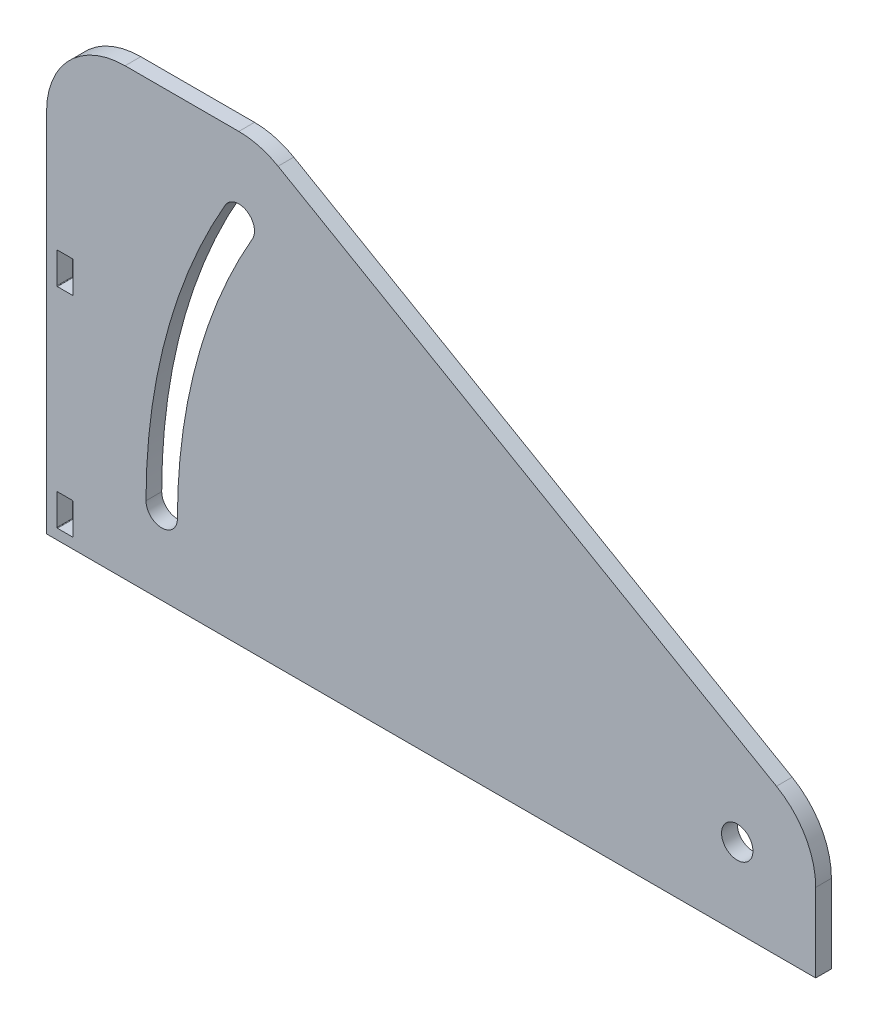
ISO-10303-21;
HEADER;
FILE_DESCRIPTION(('STEP AP214'),'2;1');
FILE_NAME('part.step','',(''),(''),'','','');
FILE_SCHEMA(('AUTOMOTIVE_DESIGN { 1 0 10303 214 1 1 1 1 }'));
ENDSEC;
DATA;
#1=APPLICATION_CONTEXT('core data for automotive mechanical design processes');
#2=APPLICATION_PROTOCOL_DEFINITION('international standard','automotive_design',2000,#1);
#3=PRODUCT_CONTEXT('',#1,'mechanical');
#4=PRODUCT('Part','Part','',(#3));
#5=PRODUCT_RELATED_PRODUCT_CATEGORY('part','',(#4));
#6=PRODUCT_DEFINITION_FORMATION('','',#4);
#7=PRODUCT_DEFINITION_CONTEXT('part definition',#1,'design');
#8=PRODUCT_DEFINITION('design','',#6,#7);
#9=PRODUCT_DEFINITION_SHAPE('','',#8);
#10=(LENGTH_UNIT() NAMED_UNIT(*) SI_UNIT(.MILLI.,.METRE.));
#11=(NAMED_UNIT(*) PLANE_ANGLE_UNIT() SI_UNIT($,.RADIAN.));
#12=(NAMED_UNIT(*) SI_UNIT($,.STERADIAN.) SOLID_ANGLE_UNIT());
#13=UNCERTAINTY_MEASURE_WITH_UNIT(LENGTH_MEASURE(1.E-05),#10,'distance_accuracy_value','');
#14=(GEOMETRIC_REPRESENTATION_CONTEXT(3) GLOBAL_UNCERTAINTY_ASSIGNED_CONTEXT((#13)) GLOBAL_UNIT_ASSIGNED_CONTEXT((#10,
#11,#12)) REPRESENTATION_CONTEXT('',''));
#15=CARTESIAN_POINT('',(0.,0.,0.));
#16=DIRECTION('',(0.,0.,1.));
#17=DIRECTION('',(1.,0.,0.));
#18=AXIS2_PLACEMENT_3D('',#15,#16,#17);
#19=CARTESIAN_POINT('',(0.,-0.525000000000063,3.));
#20=DIRECTION('',(0.,-1.,0.));
#21=DIRECTION('',(0.,0.,-1.));
#22=AXIS2_PLACEMENT_3D('',#19,#20,#21);
#23=PLANE('',#22);
#24=DIRECTION('',(-1.,0.,0.));
#25=VECTOR('',#24,1.);
#26=CARTESIAN_POINT('',(0.,-0.525000000000063,0.));
#27=LINE('',#26,#25);
#28=CARTESIAN_POINT('',(-68.575,-0.525000000000063,0.));
#29=VERTEX_POINT('',#28);
#30=CARTESIAN_POINT('',(-71.425,-0.525000000000063,0.));
#31=VERTEX_POINT('',#30);
#32=EDGE_CURVE('E534',#29,#31,#27,.T.);
#33=ORIENTED_EDGE('',*,*,#32,.T.);
#34=DIRECTION('',(0.,0.,-1.));
#35=VECTOR('',#34,1.);
#36=CARTESIAN_POINT('',(-71.425,-0.525000000000063,3.));
#37=LINE('',#36,#35);
#38=CARTESIAN_POINT('',(-71.425,-0.525000000000063,3.));
#39=VERTEX_POINT('',#38);
#40=EDGE_CURVE('E475',#31,#39,#37,.F.);
#41=ORIENTED_EDGE('',*,*,#40,.T.);
#42=DIRECTION('',(-1.,0.,0.));
#43=VECTOR('',#42,1.);
#44=CARTESIAN_POINT('',(0.,-0.525000000000063,3.));
#45=LINE('',#44,#43);
#46=CARTESIAN_POINT('',(-68.575,-0.525000000000063,3.));
#47=VERTEX_POINT('',#46);
#48=EDGE_CURVE('E309',#47,#39,#45,.T.);
#49=ORIENTED_EDGE('',*,*,#48,.F.);
#50=DIRECTION('',(0.,0.,-1.));
#51=VECTOR('',#50,1.);
#52=CARTESIAN_POINT('',(-68.575,-0.525000000000063,3.));
#53=LINE('',#52,#51);
#54=EDGE_CURVE('E471',#47,#29,#53,.T.);
#55=ORIENTED_EDGE('',*,*,#54,.T.);
#56=EDGE_LOOP('',(#33,#41,#49,#55));
#57=FACE_BOUND('',#56,.T.);
#58=ADVANCED_FACE('F44',(#57),#23,.F.);
#59=CARTESIAN_POINT('',(-71.525,0.,3.));
#60=DIRECTION('',(-1.,0.,0.));
#61=DIRECTION('',(0.,0.,1.));
#62=AXIS2_PLACEMENT_3D('',#59,#60,#61);
#63=PLANE('',#62);
#64=DIRECTION('',(0.,1.,0.));
#65=VECTOR('',#64,1.);
#66=CARTESIAN_POINT('',(-71.525,0.,3.));
#67=LINE('',#66,#65);
#68=CARTESIAN_POINT('',(-71.525,-0.425000000000063,3.));
#69=VERTEX_POINT('',#68);
#70=CARTESIAN_POINT('',(-71.525,5.42499999999994,3.));
#71=VERTEX_POINT('',#70);
#72=EDGE_CURVE('E313',#69,#71,#67,.T.);
#73=ORIENTED_EDGE('',*,*,#72,.F.);
#74=DIRECTION('',(0.,0.,-1.));
#75=VECTOR('',#74,1.);
#76=CARTESIAN_POINT('',(-71.525,-0.425000000000063,0.));
#77=LINE('',#76,#75);
#78=CARTESIAN_POINT('',(-71.525,-0.425000000000063,0.));
#79=VERTEX_POINT('',#78);
#80=EDGE_CURVE('E467',#69,#79,#77,.T.);
#81=ORIENTED_EDGE('',*,*,#80,.T.);
#82=DIRECTION('',(0.,1.,0.));
#83=VECTOR('',#82,1.);
#84=CARTESIAN_POINT('',(-71.525,0.,0.));
#85=LINE('',#84,#83);
#86=CARTESIAN_POINT('',(-71.525,5.42499999999994,0.));
#87=VERTEX_POINT('',#86);
#88=EDGE_CURVE('E415',#79,#87,#85,.T.);
#89=ORIENTED_EDGE('',*,*,#88,.T.);
#90=DIRECTION('',(0.,0.,-1.));
#91=VECTOR('',#90,1.);
#92=CARTESIAN_POINT('',(-71.525,5.42499999999994,3.));
#93=LINE('',#92,#91);
#94=EDGE_CURVE('E464',#87,#71,#93,.F.);
#95=ORIENTED_EDGE('',*,*,#94,.T.);
#96=EDGE_LOOP('',(#73,#81,#89,#95));
#97=FACE_BOUND('',#96,.T.);
#98=ADVANCED_FACE('F639',(#97),#63,.F.);
#99=CARTESIAN_POINT('',(0.,5.52499999999994,3.));
#100=DIRECTION('',(0.,-1.,0.));
#101=DIRECTION('',(0.,0.,-1.));
#102=AXIS2_PLACEMENT_3D('',#99,#100,#101);
#103=PLANE('',#102);
#104=DIRECTION('',(-1.,0.,0.));
#105=VECTOR('',#104,1.);
#106=CARTESIAN_POINT('',(0.,5.52499999999994,0.));
#107=LINE('',#106,#105);
#108=CARTESIAN_POINT('',(-68.575,5.52499999999994,0.));
#109=VERTEX_POINT('',#108);
#110=CARTESIAN_POINT('',(-71.425,5.52499999999994,0.));
#111=VERTEX_POINT('',#110);
#112=EDGE_CURVE('E409',#109,#111,#107,.T.);
#113=ORIENTED_EDGE('',*,*,#112,.F.);
#114=DIRECTION('',(0.,0.,-1.));
#115=VECTOR('',#114,1.);
#116=CARTESIAN_POINT('',(-68.575,5.52499999999994,3.));
#117=LINE('',#116,#115);
#118=CARTESIAN_POINT('',(-68.575,5.52499999999994,3.));
#119=VERTEX_POINT('',#118);
#120=EDGE_CURVE('E67',#109,#119,#117,.F.);
#121=ORIENTED_EDGE('',*,*,#120,.T.);
#122=DIRECTION('',(-1.,0.,0.));
#123=VECTOR('',#122,1.);
#124=CARTESIAN_POINT('',(0.,5.52499999999994,3.));
#125=LINE('',#124,#123);
#126=CARTESIAN_POINT('',(-71.425,5.52499999999994,3.));
#127=VERTEX_POINT('',#126);
#128=EDGE_CURVE('E316',#119,#127,#125,.T.);
#129=ORIENTED_EDGE('',*,*,#128,.T.);
#130=DIRECTION('',(0.,0.,-1.));
#131=VECTOR('',#130,1.);
#132=CARTESIAN_POINT('',(-71.425,5.52499999999994,3.));
#133=LINE('',#132,#131);
#134=EDGE_CURVE('E513',#127,#111,#133,.T.);
#135=ORIENTED_EDGE('',*,*,#134,.T.);
#136=EDGE_LOOP('',(#113,#121,#129,#135));
#137=FACE_BOUND('',#136,.T.);
#138=ADVANCED_FACE('F596',(#137),#103,.T.);
#139=CARTESIAN_POINT('',(-68.475,0.,3.));
#140=DIRECTION('',(-1.,0.,0.));
#141=DIRECTION('',(0.,0.,1.));
#142=AXIS2_PLACEMENT_3D('',#139,#140,#141);
#143=PLANE('',#142);
#144=DIRECTION('',(0.,1.,0.));
#145=VECTOR('',#144,1.);
#146=CARTESIAN_POINT('',(-68.475,0.,0.));
#147=LINE('',#146,#145);
#148=CARTESIAN_POINT('',(-68.475,-40.4250000000001,0.));
#149=VERTEX_POINT('',#148);
#150=CARTESIAN_POINT('',(-68.475,-34.5750000000001,0.));
#151=VERTEX_POINT('',#150);
#152=EDGE_CURVE('E366',#149,#151,#147,.T.);
#153=ORIENTED_EDGE('',*,*,#152,.F.);
#154=DIRECTION('',(0.,0.,-1.));
#155=VECTOR('',#154,1.);
#156=CARTESIAN_POINT('',(-68.475,-40.4250000000001,3.));
#157=LINE('',#156,#155);
#158=CARTESIAN_POINT('',(-68.475,-40.4250000000001,3.));
#159=VERTEX_POINT('',#158);
#160=EDGE_CURVE('E496',#149,#159,#157,.F.);
#161=ORIENTED_EDGE('',*,*,#160,.T.);
#162=DIRECTION('',(0.,1.,0.));
#163=VECTOR('',#162,1.);
#164=CARTESIAN_POINT('',(-68.475,0.,3.));
#165=LINE('',#164,#163);
#166=CARTESIAN_POINT('',(-68.475,-34.5750000000001,3.));
#167=VERTEX_POINT('',#166);
#168=EDGE_CURVE('E293',#159,#167,#165,.T.);
#169=ORIENTED_EDGE('',*,*,#168,.T.);
#170=DIRECTION('',(0.,0.,-1.));
#171=VECTOR('',#170,1.);
#172=CARTESIAN_POINT('',(-68.475,-34.5750000000001,3.));
#173=LINE('',#172,#171);
#174=EDGE_CURVE('E492',#167,#151,#173,.T.);
#175=ORIENTED_EDGE('',*,*,#174,.T.);
#176=EDGE_LOOP('',(#153,#161,#169,#175));
#177=FACE_BOUND('',#176,.T.);
#178=ADVANCED_FACE('F624',(#177),#143,.T.);
#179=CARTESIAN_POINT('',(0.,-40.5250000000001,3.));
#180=DIRECTION('',(0.,1.,0.));
#181=DIRECTION('',(0.,0.,1.));
#182=AXIS2_PLACEMENT_3D('',#179,#180,#181);
#183=PLANE('',#182);
#184=DIRECTION('',(1.,0.,0.));
#185=VECTOR('',#184,1.);
#186=CARTESIAN_POINT('',(0.,-40.5250000000001,0.));
#187=LINE('',#186,#185);
#188=CARTESIAN_POINT('',(-71.425,-40.5250000000001,0.));
#189=VERTEX_POINT('',#188);
#190=CARTESIAN_POINT('',(-68.575,-40.5250000000001,0.));
#191=VERTEX_POINT('',#190);
#192=EDGE_CURVE('E373',#189,#191,#187,.T.);
#193=ORIENTED_EDGE('',*,*,#192,.F.);
#194=DIRECTION('',(0.,0.,-1.));
#195=VECTOR('',#194,1.);
#196=CARTESIAN_POINT('',(-71.425,-40.5250000000001,3.));
#197=LINE('',#196,#195);
#198=CARTESIAN_POINT('',(-71.425,-40.5250000000001,3.));
#199=VERTEX_POINT('',#198);
#200=EDGE_CURVE('E489',#189,#199,#197,.F.);
#201=ORIENTED_EDGE('',*,*,#200,.T.);
#202=DIRECTION('',(1.,0.,0.));
#203=VECTOR('',#202,1.);
#204=CARTESIAN_POINT('',(0.,-40.5250000000001,3.));
#205=LINE('',#204,#203);
#206=CARTESIAN_POINT('',(-68.575,-40.5250000000001,3.));
#207=VERTEX_POINT('',#206);
#208=EDGE_CURVE('E297',#199,#207,#205,.T.);
#209=ORIENTED_EDGE('',*,*,#208,.T.);
#210=DIRECTION('',(0.,0.,-1.));
#211=VECTOR('',#210,1.);
#212=CARTESIAN_POINT('',(-68.575,-40.5250000000001,0.));
#213=LINE('',#212,#211);
#214=EDGE_CURVE('E485',#207,#191,#213,.T.);
#215=ORIENTED_EDGE('',*,*,#214,.T.);
#216=EDGE_LOOP('',(#193,#201,#209,#215));
#217=FACE_BOUND('',#216,.T.);
#218=ADVANCED_FACE('F559',(#217),#183,.T.);
#219=CARTESIAN_POINT('',(-71.525,0.,3.));
#220=DIRECTION('',(-1.,0.,0.));
#221=DIRECTION('',(0.,0.,1.));
#222=AXIS2_PLACEMENT_3D('',#219,#220,#221);
#223=PLANE('',#222);
#224=DIRECTION('',(0.,1.,0.));
#225=VECTOR('',#224,1.);
#226=CARTESIAN_POINT('',(-71.525,0.,3.));
#227=LINE('',#226,#225);
#228=CARTESIAN_POINT('',(-71.525,-40.4250000000001,3.));
#229=VERTEX_POINT('',#228);
#230=CARTESIAN_POINT('',(-71.525,-34.5750000000001,3.));
#231=VERTEX_POINT('',#230);
#232=EDGE_CURVE('E301',#229,#231,#227,.T.);
#233=ORIENTED_EDGE('',*,*,#232,.F.);
#234=DIRECTION('',(0.,0.,-1.));
#235=VECTOR('',#234,1.);
#236=CARTESIAN_POINT('',(-71.525,-40.4250000000001,3.));
#237=LINE('',#236,#235);
#238=CARTESIAN_POINT('',(-71.525,-40.4250000000001,0.));
#239=VERTEX_POINT('',#238);
#240=EDGE_CURVE('E481',#229,#239,#237,.T.);
#241=ORIENTED_EDGE('',*,*,#240,.T.);
#242=DIRECTION('',(0.,1.,0.));
#243=VECTOR('',#242,1.);
#244=CARTESIAN_POINT('',(-71.525,0.,0.));
#245=LINE('',#244,#243);
#246=CARTESIAN_POINT('',(-71.525,-34.5750000000001,0.));
#247=VERTEX_POINT('',#246);
#248=EDGE_CURVE('E542',#239,#247,#245,.T.);
#249=ORIENTED_EDGE('',*,*,#248,.T.);
#250=DIRECTION('',(0.,0.,-1.));
#251=VECTOR('',#250,1.);
#252=CARTESIAN_POINT('',(-71.525,-34.5750000000001,3.));
#253=LINE('',#252,#251);
#254=EDGE_CURVE('E478',#247,#231,#253,.F.);
#255=ORIENTED_EDGE('',*,*,#254,.T.);
#256=EDGE_LOOP('',(#233,#241,#249,#255));
#257=FACE_BOUND('',#256,.T.);
#258=ADVANCED_FACE('F651',(#257),#223,.F.);
#259=CARTESIAN_POINT('',(58.5,-27.5000000000001,3.));
#260=DIRECTION('',(0.,0.,-1.));
#261=DIRECTION('',(-1.,0.,0.));
#262=AXIS2_PLACEMENT_3D('',#259,#260,#261);
#263=CYLINDRICAL_SURFACE('',#262,107.);
#264=CARTESIAN_POINT('',(58.5,-27.5000000000001,0.));
#265=DIRECTION('',(0.,0.,1.));
#266=DIRECTION('',(1.,0.,0.));
#267=AXIS2_PLACEMENT_3D('',#264,#265,#266);
#268=CIRCLE('',#267,107.);
#269=CARTESIAN_POINT('',(-34.1647182049349,26.0000000000001,0.));
#270=VERTEX_POINT('',#269);
#271=CARTESIAN_POINT('',(-48.5,-27.5000000000001,0.));
#272=VERTEX_POINT('',#271);
#273=EDGE_CURVE('E346',#270,#272,#268,.T.);
#274=ORIENTED_EDGE('',*,*,#273,.T.);
#275=DIRECTION('',(0.,0.,-1.));
#276=VECTOR('',#275,1.);
#277=CARTESIAN_POINT('',(-48.5,-27.5000000000001,3.));
#278=LINE('',#277,#276);
#279=CARTESIAN_POINT('',(-48.5,-27.5000000000001,3.));
#280=VERTEX_POINT('',#279);
#281=EDGE_CURVE('E433',#280,#272,#278,.T.);
#282=ORIENTED_EDGE('',*,*,#281,.F.);
#283=CARTESIAN_POINT('',(58.5,-27.5000000000001,3.));
#284=DIRECTION('',(0.,0.,1.));
#285=DIRECTION('',(1.,0.,0.));
#286=AXIS2_PLACEMENT_3D('',#283,#284,#285);
#287=CIRCLE('',#286,107.);
#288=CARTESIAN_POINT('',(-34.1647182049349,26.0000000000001,3.));
#289=VERTEX_POINT('',#288);
#290=EDGE_CURVE('E278',#289,#280,#287,.T.);
#291=ORIENTED_EDGE('',*,*,#290,.F.);
#292=DIRECTION('',(0.,0.,-1.));
#293=VECTOR('',#292,1.);
#294=CARTESIAN_POINT('',(-34.1647182049349,26.0000000000001,3.));
#295=LINE('',#294,#293);
#296=EDGE_CURVE('E255',#289,#270,#295,.T.);
#297=ORIENTED_EDGE('',*,*,#296,.T.);
#298=EDGE_LOOP('',(#274,#282,#291,#297));
#299=FACE_BOUND('',#298,.T.);
#300=ADVANCED_FACE('F654',(#299),#263,.T.);
#301=CARTESIAN_POINT('',(-51.5,-27.5000000000001,3.));
#302=DIRECTION('',(0.,0.,-1.));
#303=DIRECTION('',(-1.,0.,0.));
#304=AXIS2_PLACEMENT_3D('',#301,#302,#303);
#305=CYLINDRICAL_SURFACE('',#304,2.99999999999999);
#306=CARTESIAN_POINT('',(-51.5,-27.5000000000001,0.));
#307=DIRECTION('',(0.,0.,1.));
#308=DIRECTION('',(1.,0.,0.));
#309=AXIS2_PLACEMENT_3D('',#306,#307,#308);
#310=CIRCLE('',#309,2.99999999999999);
#311=CARTESIAN_POINT('',(-54.5,-27.5000000000001,0.));
#312=VERTEX_POINT('',#311);
#313=EDGE_CURVE('E354',#312,#272,#310,.T.);
#314=ORIENTED_EDGE('',*,*,#313,.F.);
#315=DIRECTION('',(0.,0.,-1.));
#316=VECTOR('',#315,1.);
#317=CARTESIAN_POINT('',(-54.5,-27.5000000000001,3.));
#318=LINE('',#317,#316);
#319=CARTESIAN_POINT('',(-54.5,-27.5000000000001,3.));
#320=VERTEX_POINT('',#319);
#321=EDGE_CURVE('E430',#320,#312,#318,.T.);
#322=ORIENTED_EDGE('',*,*,#321,.F.);
#323=CARTESIAN_POINT('',(-51.5,-27.5000000000001,3.));
#324=DIRECTION('',(0.,0.,1.));
#325=DIRECTION('',(1.,0.,0.));
#326=AXIS2_PLACEMENT_3D('',#323,#324,#325);
#327=CIRCLE('',#326,2.99999999999999);
#328=EDGE_CURVE('E281',#320,#280,#327,.T.);
#329=ORIENTED_EDGE('',*,*,#328,.T.);
#330=ORIENTED_EDGE('',*,*,#281,.T.);
#331=EDGE_LOOP('',(#314,#322,#329,#330));
#332=FACE_BOUND('',#331,.T.);
#333=ADVANCED_FACE('F666',(#332),#305,.F.);
#334=CARTESIAN_POINT('',(58.5,-27.5000000000001,3.));
#335=DIRECTION('',(0.,0.,-1.));
#336=DIRECTION('',(-1.,0.,0.));
#337=AXIS2_PLACEMENT_3D('',#334,#335,#336);
#338=CYLINDRICAL_SURFACE('',#337,113.);
#339=CARTESIAN_POINT('',(58.5,-27.5000000000001,0.));
#340=DIRECTION('',(0.,0.,1.));
#341=DIRECTION('',(1.,0.,0.));
#342=AXIS2_PLACEMENT_3D('',#339,#340,#341);
#343=CIRCLE('',#342,113.);
#344=CARTESIAN_POINT('',(-39.3608706276415,29.0000000000001,0.));
#345=VERTEX_POINT('',#344);
#346=EDGE_CURVE('E367',#345,#312,#343,.T.);
#347=ORIENTED_EDGE('',*,*,#346,.F.);
#348=DIRECTION('',(0.,0.,-1.));
#349=VECTOR('',#348,1.);
#350=CARTESIAN_POINT('',(-39.3608706276415,29.0000000000001,3.));
#351=LINE('',#350,#349);
#352=CARTESIAN_POINT('',(-39.3608706276415,29.0000000000001,3.));
#353=VERTEX_POINT('',#352);
#354=EDGE_CURVE('E427',#353,#345,#351,.T.);
#355=ORIENTED_EDGE('',*,*,#354,.F.);
#356=CARTESIAN_POINT('',(58.5,-27.5000000000001,3.));
#357=DIRECTION('',(0.,0.,1.));
#358=DIRECTION('',(1.,0.,0.));
#359=AXIS2_PLACEMENT_3D('',#356,#357,#358);
#360=CIRCLE('',#359,113.);
#361=EDGE_CURVE('E285',#353,#320,#360,.T.);
#362=ORIENTED_EDGE('',*,*,#361,.T.);
#363=ORIENTED_EDGE('',*,*,#321,.T.);
#364=EDGE_LOOP('',(#347,#355,#362,#363));
#365=FACE_BOUND('',#364,.T.);
#366=ADVANCED_FACE('F663',(#365),#338,.F.);
#367=CARTESIAN_POINT('',(0.,-42.5000000000001,3.));
#368=DIRECTION('',(0.,1.,0.));
#369=DIRECTION('',(0.,0.,1.));
#370=AXIS2_PLACEMENT_3D('',#367,#368,#369);
#371=PLANE('',#370);
#372=DIRECTION('',(1.,0.,0.));
#373=VECTOR('',#372,1.);
#374=CARTESIAN_POINT('',(0.,-42.5000000000001,0.));
#375=LINE('',#374,#373);
#376=CARTESIAN_POINT('',(-73.5,-42.5000000000001,0.));
#377=VERTEX_POINT('',#376);
#378=CARTESIAN_POINT('',(73.5,-42.5000000000001,0.));
#379=VERTEX_POINT('',#378);
#380=EDGE_CURVE('E250',#377,#379,#375,.T.);
#381=ORIENTED_EDGE('',*,*,#380,.T.);
#382=DIRECTION('',(0.,0.,-1.));
#383=VECTOR('',#382,1.);
#384=CARTESIAN_POINT('',(73.5,-42.5000000000001,3.));
#385=LINE('',#384,#383);
#386=CARTESIAN_POINT('',(73.5,-42.5000000000001,3.));
#387=VERTEX_POINT('',#386);
#388=EDGE_CURVE('E247',#387,#379,#385,.T.);
#389=ORIENTED_EDGE('',*,*,#388,.F.);
#390=DIRECTION('',(1.,0.,0.));
#391=VECTOR('',#390,1.);
#392=CARTESIAN_POINT('',(0.,-42.5000000000001,3.));
#393=LINE('',#392,#391);
#394=CARTESIAN_POINT('',(-73.5,-42.5000000000001,3.));
#395=VERTEX_POINT('',#394);
#396=EDGE_CURVE('E231',#395,#387,#393,.T.);
#397=ORIENTED_EDGE('',*,*,#396,.F.);
#398=DIRECTION('',(0.,0.,-1.));
#399=VECTOR('',#398,1.);
#400=CARTESIAN_POINT('',(-73.5,-42.5000000000001,3.));
#401=LINE('',#400,#399);
#402=EDGE_CURVE('E327',#395,#377,#401,.T.);
#403=ORIENTED_EDGE('',*,*,#402,.T.);
#404=EDGE_LOOP('',(#381,#389,#397,#403));
#405=FACE_BOUND('',#404,.T.);
#406=ADVANCED_FACE('F248',(#405),#371,.F.);
#407=CARTESIAN_POINT('',(73.5,0.,3.));
#408=DIRECTION('',(1.,0.,0.));
#409=DIRECTION('',(0.,1.,0.));
#410=AXIS2_PLACEMENT_3D('',#407,#408,#409);
#411=PLANE('',#410);
#412=DIRECTION('',(0.,-1.,0.));
#413=VECTOR('',#412,1.);
#414=CARTESIAN_POINT('',(73.5,0.,0.));
#415=LINE('',#414,#413);
#416=CARTESIAN_POINT('',(73.5,-27.5000000000001,0.));
#417=VERTEX_POINT('',#416);
#418=EDGE_CURVE('E331',#417,#379,#415,.T.);
#419=ORIENTED_EDGE('',*,*,#418,.F.);
#420=DIRECTION('',(0.,0.,-1.));
#421=VECTOR('',#420,1.);
#422=CARTESIAN_POINT('',(73.5,-27.5000000000001,3.));
#423=LINE('',#422,#421);
#424=CARTESIAN_POINT('',(73.5,-27.5000000000001,3.));
#425=VERTEX_POINT('',#424);
#426=EDGE_CURVE('E256',#425,#417,#423,.T.);
#427=ORIENTED_EDGE('',*,*,#426,.F.);
#428=DIRECTION('',(0.,-1.,0.));
#429=VECTOR('',#428,1.);
#430=CARTESIAN_POINT('',(73.5,0.,3.));
#431=LINE('',#430,#429);
#432=EDGE_CURVE('E237',#425,#387,#431,.T.);
#433=ORIENTED_EDGE('',*,*,#432,.T.);
#434=ORIENTED_EDGE('',*,*,#388,.T.);
#435=EDGE_LOOP('',(#419,#427,#433,#434));
#436=FACE_BOUND('',#435,.T.);
#437=ADVANCED_FACE('F258',(#436),#411,.T.);
#438=CARTESIAN_POINT('',(58.5,-27.5000000000001,3.));
#439=DIRECTION('',(0.,0.,-1.));
#440=DIRECTION('',(-1.,0.,0.));
#441=AXIS2_PLACEMENT_3D('',#438,#439,#440);
#442=CYLINDRICAL_SURFACE('',#441,15.);
#443=CARTESIAN_POINT('',(58.5,-27.5000000000001,0.));
#444=DIRECTION('',(0.,0.,1.));
#445=DIRECTION('',(1.,0.,0.));
#446=AXIS2_PLACEMENT_3D('',#443,#444,#445);
#447=CIRCLE('',#446,15.);
#448=CARTESIAN_POINT('',(66.,-14.5096189432335,0.));
#449=VERTEX_POINT('',#448);
#450=EDGE_CURVE('E1053',#417,#449,#447,.T.);
#451=ORIENTED_EDGE('',*,*,#450,.T.);
#452=DIRECTION('',(0.,0.,-1.));
#453=VECTOR('',#452,1.);
#454=CARTESIAN_POINT('',(66.,-14.5096189432335,3.));
#455=LINE('',#454,#453);
#456=CARTESIAN_POINT('',(66.,-14.5096189432335,3.));
#457=VERTEX_POINT('',#456);
#458=EDGE_CURVE('E446',#457,#449,#455,.T.);
#459=ORIENTED_EDGE('',*,*,#458,.F.);
#460=CARTESIAN_POINT('',(58.5,-27.5000000000001,3.));
#461=DIRECTION('',(0.,0.,1.));
#462=DIRECTION('',(1.,0.,0.));
#463=AXIS2_PLACEMENT_3D('',#460,#461,#462);
#464=CIRCLE('',#463,15.);
#465=EDGE_CURVE('E261',#425,#457,#464,.T.);
#466=ORIENTED_EDGE('',*,*,#465,.F.);
#467=ORIENTED_EDGE('',*,*,#426,.T.);
#468=EDGE_LOOP('',(#451,#459,#466,#467));
#469=FACE_BOUND('',#468,.T.);
#470=ADVANCED_FACE('F689',(#469),#442,.T.);
#471=CARTESIAN_POINT('',(10.217150697964,17.6966241174614,3.));
#472=DIRECTION('',(-0.500000000000001,-0.866025403784438,0.));
#473=DIRECTION('',(0.866025403784438,-0.500000000000001,0.));
#474=AXIS2_PLACEMENT_3D('',#471,#472,#473);
#475=PLANE('',#474);
#476=DIRECTION('',(-0.866025403784438,0.500000000000001,0.));
#477=VECTOR('',#476,1.);
#478=CARTESIAN_POINT('',(10.217150697964,17.6966241174614,0.));
#479=LINE('',#478,#477);
#480=CARTESIAN_POINT('',(-29.2627944162882,40.4903810567666,0.));
#481=VERTEX_POINT('',#480);
#482=EDGE_CURVE('E1050',#449,#481,#479,.T.);
#483=ORIENTED_EDGE('',*,*,#482,.T.);
#484=DIRECTION('',(0.,0.,-1.));
#485=VECTOR('',#484,1.);
#486=CARTESIAN_POINT('',(-29.2627944162882,40.4903810567666,3.));
#487=LINE('',#486,#485);
#488=CARTESIAN_POINT('',(-29.2627944162882,40.4903810567666,3.));
#489=VERTEX_POINT('',#488);
#490=EDGE_CURVE('E458',#481,#489,#487,.F.);
#491=ORIENTED_EDGE('',*,*,#490,.T.);
#492=DIRECTION('',(-0.866025403784438,0.500000000000001,0.));
#493=VECTOR('',#492,1.);
#494=CARTESIAN_POINT('',(10.217150697964,17.6966241174614,3.));
#495=LINE('',#494,#493);
#496=EDGE_CURVE('E264',#457,#489,#495,.T.);
#497=ORIENTED_EDGE('',*,*,#496,.F.);
#498=ORIENTED_EDGE('',*,*,#458,.T.);
#499=EDGE_LOOP('',(#483,#491,#497,#498));
#500=FACE_BOUND('',#499,.T.);
#501=ADVANCED_FACE('F685',(#500),#475,.F.);
#502=CARTESIAN_POINT('',(0.,42.5,3.));
#503=DIRECTION('',(0.,1.,0.));
#504=DIRECTION('',(0.,0.,1.));
#505=AXIS2_PLACEMENT_3D('',#502,#503,#504);
#506=PLANE('',#505);
#507=DIRECTION('',(1.,0.,0.));
#508=VECTOR('',#507,1.);
#509=CARTESIAN_POINT('',(0.,42.5,3.));
#510=LINE('',#509,#508);
#511=CARTESIAN_POINT('',(-58.5,42.5,3.));
#512=VERTEX_POINT('',#511);
#513=CARTESIAN_POINT('',(-36.7627944162882,42.5,3.));
#514=VERTEX_POINT('',#513);
#515=EDGE_CURVE('E269',#512,#514,#510,.T.);
#516=ORIENTED_EDGE('',*,*,#515,.T.);
#517=DIRECTION('',(0.,0.,-1.));
#518=VECTOR('',#517,1.);
#519=CARTESIAN_POINT('',(-36.7627944162882,42.5,0.));
#520=LINE('',#519,#518);
#521=CARTESIAN_POINT('',(-36.7627944162882,42.5,0.));
#522=VERTEX_POINT('',#521);
#523=EDGE_CURVE('E436',#514,#522,#520,.T.);
#524=ORIENTED_EDGE('',*,*,#523,.T.);
#525=DIRECTION('',(1.,0.,0.));
#526=VECTOR('',#525,1.);
#527=CARTESIAN_POINT('',(0.,42.5,0.));
#528=LINE('',#527,#526);
#529=CARTESIAN_POINT('',(-58.5,42.5,0.));
#530=VERTEX_POINT('',#529);
#531=EDGE_CURVE('E1034',#530,#522,#528,.T.);
#532=ORIENTED_EDGE('',*,*,#531,.F.);
#533=DIRECTION('',(0.,0.,-1.));
#534=VECTOR('',#533,1.);
#535=CARTESIAN_POINT('',(-58.5,42.5,3.));
#536=LINE('',#535,#534);
#537=EDGE_CURVE('E443',#512,#530,#536,.T.);
#538=ORIENTED_EDGE('',*,*,#537,.F.);
#539=EDGE_LOOP('',(#516,#524,#532,#538));
#540=FACE_BOUND('',#539,.T.);
#541=ADVANCED_FACE('F681',(#540),#506,.T.);
#542=CARTESIAN_POINT('',(-58.5,27.5,3.));
#543=DIRECTION('',(0.,0.,-1.));
#544=DIRECTION('',(-1.,0.,0.));
#545=AXIS2_PLACEMENT_3D('',#542,#543,#544);
#546=CYLINDRICAL_SURFACE('',#545,15.);
#547=CARTESIAN_POINT('',(-58.5,27.5,0.));
#548=DIRECTION('',(0.,0.,1.));
#549=DIRECTION('',(1.,0.,0.));
#550=AXIS2_PLACEMENT_3D('',#547,#548,#549);
#551=CIRCLE('',#550,15.);
#552=CARTESIAN_POINT('',(-73.5,27.5,0.));
#553=VERTEX_POINT('',#552);
#554=EDGE_CURVE('E347',#530,#553,#551,.T.);
#555=ORIENTED_EDGE('',*,*,#554,.T.);
#556=DIRECTION('',(0.,0.,-1.));
#557=VECTOR('',#556,1.);
#558=CARTESIAN_POINT('',(-73.5,27.5,3.));
#559=LINE('',#558,#557);
#560=CARTESIAN_POINT('',(-73.5,27.5,3.));
#561=VERTEX_POINT('',#560);
#562=EDGE_CURVE('E439',#561,#553,#559,.T.);
#563=ORIENTED_EDGE('',*,*,#562,.F.);
#564=CARTESIAN_POINT('',(-58.5,27.5,3.));
#565=DIRECTION('',(0.,0.,1.));
#566=DIRECTION('',(1.,0.,0.));
#567=AXIS2_PLACEMENT_3D('',#564,#565,#566);
#568=CIRCLE('',#567,15.);
#569=EDGE_CURVE('E273',#512,#561,#568,.T.);
#570=ORIENTED_EDGE('',*,*,#569,.F.);
#571=ORIENTED_EDGE('',*,*,#537,.T.);
#572=EDGE_LOOP('',(#555,#563,#570,#571));
#573=FACE_BOUND('',#572,.T.);
#574=ADVANCED_FACE('F678',(#573),#546,.T.);
#575=CARTESIAN_POINT('',(-68.475,0.,3.));
#576=DIRECTION('',(-1.,0.,0.));
#577=DIRECTION('',(0.,0.,1.));
#578=AXIS2_PLACEMENT_3D('',#575,#576,#577);
#579=PLANE('',#578);
#580=DIRECTION('',(0.,1.,0.));
#581=VECTOR('',#580,1.);
#582=CARTESIAN_POINT('',(-68.475,0.,0.));
#583=LINE('',#582,#581);
#584=CARTESIAN_POINT('',(-68.475,-0.425000000000063,0.));
#585=VERTEX_POINT('',#584);
#586=CARTESIAN_POINT('',(-68.475,5.42499999999994,0.));
#587=VERTEX_POINT('',#586);
#588=EDGE_CURVE('E414',#585,#587,#583,.T.);
#589=ORIENTED_EDGE('',*,*,#588,.F.);
#590=DIRECTION('',(0.,0.,-1.));
#591=VECTOR('',#590,1.);
#592=CARTESIAN_POINT('',(-68.475,-0.425000000000063,3.));
#593=LINE('',#592,#591);
#594=CARTESIAN_POINT('',(-68.475,-0.425000000000063,3.));
#595=VERTEX_POINT('',#594);
#596=EDGE_CURVE('E503',#585,#595,#593,.F.);
#597=ORIENTED_EDGE('',*,*,#596,.T.);
#598=DIRECTION('',(0.,1.,0.));
#599=VECTOR('',#598,1.);
#600=CARTESIAN_POINT('',(-68.475,0.,3.));
#601=LINE('',#600,#599);
#602=CARTESIAN_POINT('',(-68.475,5.42499999999994,3.));
#603=VERTEX_POINT('',#602);
#604=EDGE_CURVE('E319',#595,#603,#601,.T.);
#605=ORIENTED_EDGE('',*,*,#604,.T.);
#606=DIRECTION('',(0.,0.,-1.));
#607=VECTOR('',#606,1.);
#608=CARTESIAN_POINT('',(-68.475,5.42499999999994,0.));
#609=LINE('',#608,#607);
#610=EDGE_CURVE('E499',#603,#587,#609,.T.);
#611=ORIENTED_EDGE('',*,*,#610,.T.);
#612=EDGE_LOOP('',(#589,#597,#605,#611));
#613=FACE_BOUND('',#612,.T.);
#614=ADVANCED_FACE('F592',(#613),#579,.T.);
#615=CARTESIAN_POINT('',(0.,-34.4750000000001,3.));
#616=DIRECTION('',(0.,1.,0.));
#617=DIRECTION('',(0.,0.,1.));
#618=AXIS2_PLACEMENT_3D('',#615,#616,#617);
#619=PLANE('',#618);
#620=DIRECTION('',(1.,0.,0.));
#621=VECTOR('',#620,1.);
#622=CARTESIAN_POINT('',(0.,-34.4750000000001,0.));
#623=LINE('',#622,#621);
#624=CARTESIAN_POINT('',(-71.425,-34.4750000000001,0.));
#625=VERTEX_POINT('',#624);
#626=CARTESIAN_POINT('',(-68.575,-34.4750000000001,0.));
#627=VERTEX_POINT('',#626);
#628=EDGE_CURVE('E538',#625,#627,#623,.T.);
#629=ORIENTED_EDGE('',*,*,#628,.T.);
#630=DIRECTION('',(0.,0.,-1.));
#631=VECTOR('',#630,1.);
#632=CARTESIAN_POINT('',(-68.575,-34.4750000000001,3.));
#633=LINE('',#632,#631);
#634=CARTESIAN_POINT('',(-68.575,-34.4750000000001,3.));
#635=VERTEX_POINT('',#634);
#636=EDGE_CURVE('E510',#627,#635,#633,.F.);
#637=ORIENTED_EDGE('',*,*,#636,.T.);
#638=DIRECTION('',(1.,0.,0.));
#639=VECTOR('',#638,1.);
#640=CARTESIAN_POINT('',(0.,-34.4750000000001,3.));
#641=LINE('',#640,#639);
#642=CARTESIAN_POINT('',(-71.425,-34.4750000000001,3.));
#643=VERTEX_POINT('',#642);
#644=EDGE_CURVE('E305',#643,#635,#641,.T.);
#645=ORIENTED_EDGE('',*,*,#644,.F.);
#646=DIRECTION('',(0.,0.,-1.));
#647=VECTOR('',#646,1.);
#648=CARTESIAN_POINT('',(-71.425,-34.4750000000001,0.));
#649=LINE('',#648,#647);
#650=EDGE_CURVE('E506',#643,#625,#649,.T.);
#651=ORIENTED_EDGE('',*,*,#650,.T.);
#652=EDGE_LOOP('',(#629,#637,#645,#651));
#653=FACE_BOUND('',#652,.T.);
#654=ADVANCED_FACE('F616',(#653),#619,.F.);
#655=CARTESIAN_POINT('',(-36.7627944162882,27.5,3.));
#656=DIRECTION('',(0.,0.,-1.));
#657=DIRECTION('',(-1.,0.,0.));
#658=AXIS2_PLACEMENT_3D('',#655,#656,#657);
#659=CYLINDRICAL_SURFACE('',#658,2.99999999999999);
#660=CARTESIAN_POINT('',(-36.7627944162882,27.5,0.));
#661=DIRECTION('',(0.,0.,1.));
#662=DIRECTION('',(1.,0.,0.));
#663=AXIS2_PLACEMENT_3D('',#660,#661,#662);
#664=CIRCLE('',#663,2.99999999999999);
#665=EDGE_CURVE('E361',#270,#345,#664,.T.);
#666=ORIENTED_EDGE('',*,*,#665,.F.);
#667=ORIENTED_EDGE('',*,*,#296,.F.);
#668=CARTESIAN_POINT('',(-36.7627944162882,27.5,3.));
#669=DIRECTION('',(0.,0.,1.));
#670=DIRECTION('',(1.,0.,0.));
#671=AXIS2_PLACEMENT_3D('',#668,#669,#670);
#672=CIRCLE('',#671,2.99999999999999);
#673=EDGE_CURVE('E289',#289,#353,#672,.T.);
#674=ORIENTED_EDGE('',*,*,#673,.T.);
#675=ORIENTED_EDGE('',*,*,#354,.T.);
#676=EDGE_LOOP('',(#666,#667,#674,#675));
#677=FACE_BOUND('',#676,.T.);
#678=ADVANCED_FACE('F650',(#677),#659,.F.);
#679=CARTESIAN_POINT('',(-73.5,0.,3.));
#680=DIRECTION('',(1.,0.,0.));
#681=DIRECTION('',(0.,1.,0.));
#682=AXIS2_PLACEMENT_3D('',#679,#680,#681);
#683=PLANE('',#682);
#684=DIRECTION('',(0.,-1.,0.));
#685=VECTOR('',#684,1.);
#686=CARTESIAN_POINT('',(-73.5,0.,0.));
#687=LINE('',#686,#685);
#688=EDGE_CURVE('E342',#553,#377,#687,.T.);
#689=ORIENTED_EDGE('',*,*,#688,.T.);
#690=ORIENTED_EDGE('',*,*,#402,.F.);
#691=DIRECTION('',(0.,-1.,0.));
#692=VECTOR('',#691,1.);
#693=CARTESIAN_POINT('',(-73.5,0.,3.));
#694=LINE('',#693,#692);
#695=EDGE_CURVE('E239',#561,#395,#694,.T.);
#696=ORIENTED_EDGE('',*,*,#695,.F.);
#697=ORIENTED_EDGE('',*,*,#562,.T.);
#698=EDGE_LOOP('',(#689,#690,#696,#697));
#699=FACE_BOUND('',#698,.T.);
#700=ADVANCED_FACE('F661',(#699),#683,.F.);
#701=CARTESIAN_POINT('',(58.5,-27.5000000000001,3.));
#702=DIRECTION('',(0.,0.,-1.));
#703=DIRECTION('',(-1.,0.,0.));
#704=AXIS2_PLACEMENT_3D('',#701,#702,#703);
#705=CYLINDRICAL_SURFACE('',#704,3.00000000000002);
#706=CARTESIAN_POINT('',(58.5,-27.5000000000001,3.));
#707=DIRECTION('',(0.,0.,1.));
#708=DIRECTION('',(1.,0.,0.));
#709=AXIS2_PLACEMENT_3D('',#706,#707,#708);
#710=CIRCLE('',#709,3.00000000000002);
#711=CARTESIAN_POINT('',(61.5,-27.5000000000001,3.));
#712=VERTEX_POINT('',#711);
#713=EDGE_CURVE('E323',#712,#712,#710,.T.);
#714=ORIENTED_EDGE('',*,*,#713,.T.);
#715=EDGE_LOOP('',(#714));
#716=FACE_BOUND('',#715,.T.);
#717=CARTESIAN_POINT('',(58.5,-27.5000000000001,0.));
#718=DIRECTION('',(0.,0.,1.));
#719=DIRECTION('',(1.,0.,0.));
#720=AXIS2_PLACEMENT_3D('',#717,#718,#719);
#721=CIRCLE('',#720,3.00000000000002);
#722=CARTESIAN_POINT('',(61.5,-27.5000000000001,0.));
#723=VERTEX_POINT('',#722);
#724=EDGE_CURVE('E244',#723,#723,#721,.T.);
#725=ORIENTED_EDGE('',*,*,#724,.F.);
#726=EDGE_LOOP('',(#725));
#727=FACE_BOUND('',#726,.T.);
#728=ADVANCED_FACE('F676',(#716,#727),#705,.F.);
#729=CARTESIAN_POINT('',(0.,0.,3.));
#730=DIRECTION('',(0.,0.,1.));
#731=DIRECTION('',(1.,0.,0.));
#732=AXIS2_PLACEMENT_3D('',#729,#730,#731);
#733=PLANE('',#732);
#734=ORIENTED_EDGE('',*,*,#496,.T.);
#735=CARTESIAN_POINT('',(-36.7627944162882,27.5,3.));
#736=DIRECTION('',(0.,0.,1.));
#737=DIRECTION('',(1.,0.,0.));
#738=AXIS2_PLACEMENT_3D('',#735,#736,#737);
#739=CIRCLE('',#738,15.);
#740=EDGE_CURVE('E461',#489,#514,#739,.T.);
#741=ORIENTED_EDGE('',*,*,#740,.T.);
#742=ORIENTED_EDGE('',*,*,#515,.F.);
#743=ORIENTED_EDGE('',*,*,#569,.T.);
#744=ORIENTED_EDGE('',*,*,#695,.T.);
#745=ORIENTED_EDGE('',*,*,#396,.T.);
#746=ORIENTED_EDGE('',*,*,#432,.F.);
#747=ORIENTED_EDGE('',*,*,#465,.T.);
#748=EDGE_LOOP('',(#734,#741,#742,#743,#744,#745,#746,#747));
#749=FACE_BOUND('',#748,.T.);
#750=ORIENTED_EDGE('',*,*,#290,.T.);
#751=ORIENTED_EDGE('',*,*,#328,.F.);
#752=ORIENTED_EDGE('',*,*,#361,.F.);
#753=ORIENTED_EDGE('',*,*,#673,.F.);
#754=EDGE_LOOP('',(#750,#751,#752,#753));
#755=FACE_BOUND('',#754,.T.);
#756=ORIENTED_EDGE('',*,*,#168,.F.);
#757=CARTESIAN_POINT('',(-68.575,-40.4250000000001,3.));
#758=DIRECTION('',(0.,0.,1.));
#759=DIRECTION('',(1.,0.,0.));
#760=AXIS2_PLACEMENT_3D('',#757,#758,#759);
#761=CIRCLE('',#760,0.1);
#762=EDGE_CURVE('E570',#159,#207,#761,.F.);
#763=ORIENTED_EDGE('',*,*,#762,.T.);
#764=ORIENTED_EDGE('',*,*,#208,.F.);
#765=CARTESIAN_POINT('',(-71.425,-40.4250000000001,3.));
#766=DIRECTION('',(0.,0.,1.));
#767=DIRECTION('',(1.,0.,0.));
#768=AXIS2_PLACEMENT_3D('',#765,#766,#767);
#769=CIRCLE('',#768,0.1);
#770=EDGE_CURVE('E530',#199,#229,#769,.F.);
#771=ORIENTED_EDGE('',*,*,#770,.T.);
#772=ORIENTED_EDGE('',*,*,#232,.T.);
#773=CARTESIAN_POINT('',(-71.425,-34.5750000000001,3.));
#774=DIRECTION('',(0.,0.,1.));
#775=DIRECTION('',(1.,0.,0.));
#776=AXIS2_PLACEMENT_3D('',#773,#774,#775);
#777=CIRCLE('',#776,0.1);
#778=EDGE_CURVE('E12',#231,#643,#777,.F.);
#779=ORIENTED_EDGE('',*,*,#778,.T.);
#780=ORIENTED_EDGE('',*,*,#644,.T.);
#781=CARTESIAN_POINT('',(-68.575,-34.5750000000001,3.));
#782=DIRECTION('',(0.,0.,1.));
#783=DIRECTION('',(1.,0.,0.));
#784=AXIS2_PLACEMENT_3D('',#781,#782,#783);
#785=CIRCLE('',#784,0.1);
#786=EDGE_CURVE('E390',#635,#167,#785,.F.);
#787=ORIENTED_EDGE('',*,*,#786,.T.);
#788=EDGE_LOOP('',(#756,#763,#764,#771,#772,#779,#780,#787));
#789=FACE_BOUND('',#788,.T.);
#790=ORIENTED_EDGE('',*,*,#604,.F.);
#791=CARTESIAN_POINT('',(-68.575,-0.425000000000063,3.));
#792=DIRECTION('',(0.,0.,1.));
#793=DIRECTION('',(1.,0.,0.));
#794=AXIS2_PLACEMENT_3D('',#791,#792,#793);
#795=CIRCLE('',#794,0.1);
#796=EDGE_CURVE('E391',#595,#47,#795,.F.);
#797=ORIENTED_EDGE('',*,*,#796,.T.);
#798=ORIENTED_EDGE('',*,*,#48,.T.);
#799=CARTESIAN_POINT('',(-71.425,-0.425000000000063,3.));
#800=DIRECTION('',(0.,0.,1.));
#801=DIRECTION('',(1.,0.,0.));
#802=AXIS2_PLACEMENT_3D('',#799,#800,#801);
#803=CIRCLE('',#802,0.1);
#804=EDGE_CURVE('E523',#39,#69,#803,.F.);
#805=ORIENTED_EDGE('',*,*,#804,.T.);
#806=ORIENTED_EDGE('',*,*,#72,.T.);
#807=CARTESIAN_POINT('',(-71.425,5.42499999999994,3.));
#808=DIRECTION('',(0.,0.,1.));
#809=DIRECTION('',(1.,0.,0.));
#810=AXIS2_PLACEMENT_3D('',#807,#808,#809);
#811=CIRCLE('',#810,0.1);
#812=EDGE_CURVE('E60',#71,#127,#811,.F.);
#813=ORIENTED_EDGE('',*,*,#812,.T.);
#814=ORIENTED_EDGE('',*,*,#128,.F.);
#815=CARTESIAN_POINT('',(-68.575,5.42499999999994,3.));
#816=DIRECTION('',(0.,0.,1.));
#817=DIRECTION('',(1.,0.,0.));
#818=AXIS2_PLACEMENT_3D('',#815,#816,#817);
#819=CIRCLE('',#818,0.1);
#820=EDGE_CURVE('E399',#119,#603,#819,.F.);
#821=ORIENTED_EDGE('',*,*,#820,.T.);
#822=EDGE_LOOP('',(#790,#797,#798,#805,#806,#813,#814,#821));
#823=FACE_BOUND('',#822,.T.);
#824=ORIENTED_EDGE('',*,*,#713,.F.);
#825=EDGE_LOOP('',(#824));
#826=FACE_BOUND('',#825,.T.);
#827=ADVANCED_FACE('F234',(#749,#755,#789,#823,#826),#733,.T.);
#828=CARTESIAN_POINT('',(0.,0.,0.));
#829=DIRECTION('',(0.,0.,1.));
#830=DIRECTION('',(1.,0.,0.));
#831=AXIS2_PLACEMENT_3D('',#828,#829,#830);
#832=PLANE('',#831);
#833=ORIENTED_EDGE('',*,*,#531,.T.);
#834=CARTESIAN_POINT('',(-36.7627944162882,27.5,0.));
#835=DIRECTION('',(0.,0.,1.));
#836=DIRECTION('',(1.,0.,0.));
#837=AXIS2_PLACEMENT_3D('',#834,#835,#836);
#838=CIRCLE('',#837,15.);
#839=EDGE_CURVE('E455',#522,#481,#838,.F.);
#840=ORIENTED_EDGE('',*,*,#839,.T.);
#841=ORIENTED_EDGE('',*,*,#482,.F.);
#842=ORIENTED_EDGE('',*,*,#450,.F.);
#843=ORIENTED_EDGE('',*,*,#418,.T.);
#844=ORIENTED_EDGE('',*,*,#380,.F.);
#845=ORIENTED_EDGE('',*,*,#688,.F.);
#846=ORIENTED_EDGE('',*,*,#554,.F.);
#847=EDGE_LOOP('',(#833,#840,#841,#842,#843,#844,#845,#846));
#848=FACE_BOUND('',#847,.T.);
#849=ORIENTED_EDGE('',*,*,#273,.F.);
#850=ORIENTED_EDGE('',*,*,#665,.T.);
#851=ORIENTED_EDGE('',*,*,#346,.T.);
#852=ORIENTED_EDGE('',*,*,#313,.T.);
#853=EDGE_LOOP('',(#849,#850,#851,#852));
#854=FACE_BOUND('',#853,.T.);
#855=ORIENTED_EDGE('',*,*,#192,.T.);
#856=CARTESIAN_POINT('',(-68.575,-40.4250000000001,0.));
#857=DIRECTION('',(0.,0.,1.));
#858=DIRECTION('',(1.,0.,0.));
#859=AXIS2_PLACEMENT_3D('',#856,#857,#858);
#860=CIRCLE('',#859,0.1);
#861=EDGE_CURVE('E555',#191,#149,#860,.T.);
#862=ORIENTED_EDGE('',*,*,#861,.T.);
#863=ORIENTED_EDGE('',*,*,#152,.T.);
#864=CARTESIAN_POINT('',(-68.575,-34.5750000000001,0.));
#865=DIRECTION('',(0.,0.,1.));
#866=DIRECTION('',(1.,0.,0.));
#867=AXIS2_PLACEMENT_3D('',#864,#865,#866);
#868=CIRCLE('',#867,0.1);
#869=EDGE_CURVE('E385',#151,#627,#868,.T.);
#870=ORIENTED_EDGE('',*,*,#869,.T.);
#871=ORIENTED_EDGE('',*,*,#628,.F.);
#872=CARTESIAN_POINT('',(-71.425,-34.5750000000001,0.));
#873=DIRECTION('',(0.,0.,1.));
#874=DIRECTION('',(1.,0.,0.));
#875=AXIS2_PLACEMENT_3D('',#872,#873,#874);
#876=CIRCLE('',#875,0.1);
#877=EDGE_CURVE('E53',#625,#247,#876,.T.);
#878=ORIENTED_EDGE('',*,*,#877,.T.);
#879=ORIENTED_EDGE('',*,*,#248,.F.);
#880=CARTESIAN_POINT('',(-71.425,-40.4250000000001,0.));
#881=DIRECTION('',(0.,0.,1.));
#882=DIRECTION('',(1.,0.,0.));
#883=AXIS2_PLACEMENT_3D('',#880,#881,#882);
#884=CIRCLE('',#883,0.1);
#885=EDGE_CURVE('E526',#239,#189,#884,.T.);
#886=ORIENTED_EDGE('',*,*,#885,.T.);
#887=EDGE_LOOP('',(#855,#862,#863,#870,#871,#878,#879,#886));
#888=FACE_BOUND('',#887,.T.);
#889=ORIENTED_EDGE('',*,*,#32,.F.);
#890=CARTESIAN_POINT('',(-68.575,-0.425000000000063,0.));
#891=DIRECTION('',(0.,0.,1.));
#892=DIRECTION('',(1.,0.,0.));
#893=AXIS2_PLACEMENT_3D('',#890,#891,#892);
#894=CIRCLE('',#893,0.1);
#895=EDGE_CURVE('E572',#29,#585,#894,.T.);
#896=ORIENTED_EDGE('',*,*,#895,.T.);
#897=ORIENTED_EDGE('',*,*,#588,.T.);
#898=CARTESIAN_POINT('',(-68.575,5.42499999999994,0.));
#899=DIRECTION('',(0.,0.,1.));
#900=DIRECTION('',(1.,0.,0.));
#901=AXIS2_PLACEMENT_3D('',#898,#899,#900);
#902=CIRCLE('',#901,0.1);
#903=EDGE_CURVE('E395',#587,#109,#902,.T.);
#904=ORIENTED_EDGE('',*,*,#903,.T.);
#905=ORIENTED_EDGE('',*,*,#112,.T.);
#906=CARTESIAN_POINT('',(-71.425,5.42499999999994,0.));
#907=DIRECTION('',(0.,0.,1.));
#908=DIRECTION('',(1.,0.,0.));
#909=AXIS2_PLACEMENT_3D('',#906,#907,#908);
#910=CIRCLE('',#909,0.1);
#911=EDGE_CURVE('E601',#111,#87,#910,.T.);
#912=ORIENTED_EDGE('',*,*,#911,.T.);
#913=ORIENTED_EDGE('',*,*,#88,.F.);
#914=CARTESIAN_POINT('',(-71.425,-0.425000000000063,0.));
#915=DIRECTION('',(0.,0.,1.));
#916=DIRECTION('',(1.,0.,0.));
#917=AXIS2_PLACEMENT_3D('',#914,#915,#916);
#918=CIRCLE('',#917,0.1);
#919=EDGE_CURVE('E519',#79,#31,#918,.T.);
#920=ORIENTED_EDGE('',*,*,#919,.T.);
#921=EDGE_LOOP('',(#889,#896,#897,#904,#905,#912,#913,#920));
#922=FACE_BOUND('',#921,.T.);
#923=ORIENTED_EDGE('',*,*,#724,.T.);
#924=EDGE_LOOP('',(#923));
#925=FACE_BOUND('',#924,.T.);
#926=ADVANCED_FACE('F553',(#848,#854,#888,#922,#925),#832,.F.);
#927=CARTESIAN_POINT('',(-36.7627944162882,27.5,3.));
#928=DIRECTION('',(0.,0.,1.));
#929=DIRECTION('',(1.,0.,0.));
#930=AXIS2_PLACEMENT_3D('',#927,#928,#929);
#931=CYLINDRICAL_SURFACE('',#930,15.);
#932=ORIENTED_EDGE('',*,*,#740,.F.);
#933=ORIENTED_EDGE('',*,*,#490,.F.);
#934=ORIENTED_EDGE('',*,*,#839,.F.);
#935=ORIENTED_EDGE('',*,*,#523,.F.);
#936=EDGE_LOOP('',(#932,#933,#934,#935));
#937=FACE_BOUND('',#936,.T.);
#938=ADVANCED_FACE('F698',(#937),#931,.T.);
#939=CARTESIAN_POINT('',(-71.425,-0.425000000000063,3.));
#940=DIRECTION('',(0.,0.,1.));
#941=DIRECTION('',(1.,0.,0.));
#942=AXIS2_PLACEMENT_3D('',#939,#940,#941);
#943=CYLINDRICAL_SURFACE('',#942,0.1);
#944=ORIENTED_EDGE('',*,*,#804,.F.);
#945=ORIENTED_EDGE('',*,*,#40,.F.);
#946=ORIENTED_EDGE('',*,*,#919,.F.);
#947=ORIENTED_EDGE('',*,*,#80,.F.);
#948=EDGE_LOOP('',(#944,#945,#946,#947));
#949=FACE_BOUND('',#948,.T.);
#950=ADVANCED_FACE('F636',(#949),#943,.F.);
#951=CARTESIAN_POINT('',(-71.425,-40.4250000000001,3.));
#952=DIRECTION('',(0.,0.,-1.));
#953=DIRECTION('',(-1.,0.,0.));
#954=AXIS2_PLACEMENT_3D('',#951,#952,#953);
#955=CYLINDRICAL_SURFACE('',#954,0.1);
#956=ORIENTED_EDGE('',*,*,#770,.F.);
#957=ORIENTED_EDGE('',*,*,#200,.F.);
#958=ORIENTED_EDGE('',*,*,#885,.F.);
#959=ORIENTED_EDGE('',*,*,#240,.F.);
#960=EDGE_LOOP('',(#956,#957,#958,#959));
#961=FACE_BOUND('',#960,.T.);
#962=ADVANCED_FACE('F564',(#961),#955,.F.);
#963=CARTESIAN_POINT('',(-68.575,-40.4250000000001,3.));
#964=DIRECTION('',(0.,0.,1.));
#965=DIRECTION('',(1.,0.,0.));
#966=AXIS2_PLACEMENT_3D('',#963,#964,#965);
#967=CYLINDRICAL_SURFACE('',#966,0.1);
#968=ORIENTED_EDGE('',*,*,#762,.F.);
#969=ORIENTED_EDGE('',*,*,#160,.F.);
#970=ORIENTED_EDGE('',*,*,#861,.F.);
#971=ORIENTED_EDGE('',*,*,#214,.F.);
#972=EDGE_LOOP('',(#968,#969,#970,#971));
#973=FACE_BOUND('',#972,.T.);
#974=ADVANCED_FACE('F628',(#973),#967,.F.);
#975=CARTESIAN_POINT('',(-68.575,-0.425000000000063,3.));
#976=DIRECTION('',(0.,0.,-1.));
#977=DIRECTION('',(-1.,0.,0.));
#978=AXIS2_PLACEMENT_3D('',#975,#976,#977);
#979=CYLINDRICAL_SURFACE('',#978,0.1);
#980=ORIENTED_EDGE('',*,*,#796,.F.);
#981=ORIENTED_EDGE('',*,*,#596,.F.);
#982=ORIENTED_EDGE('',*,*,#895,.F.);
#983=ORIENTED_EDGE('',*,*,#54,.F.);
#984=EDGE_LOOP('',(#980,#981,#982,#983));
#985=FACE_BOUND('',#984,.T.);
#986=ADVANCED_FACE('F590',(#985),#979,.F.);
#987=CARTESIAN_POINT('',(-68.575,-34.5750000000001,3.));
#988=DIRECTION('',(0.,0.,-1.));
#989=DIRECTION('',(-1.,0.,0.));
#990=AXIS2_PLACEMENT_3D('',#987,#988,#989);
#991=CYLINDRICAL_SURFACE('',#990,0.1);
#992=ORIENTED_EDGE('',*,*,#786,.F.);
#993=ORIENTED_EDGE('',*,*,#636,.F.);
#994=ORIENTED_EDGE('',*,*,#869,.F.);
#995=ORIENTED_EDGE('',*,*,#174,.F.);
#996=EDGE_LOOP('',(#992,#993,#994,#995));
#997=FACE_BOUND('',#996,.T.);
#998=ADVANCED_FACE('F622',(#997),#991,.F.);
#999=CARTESIAN_POINT('',(-68.575,5.42499999999994,3.));
#1000=DIRECTION('',(0.,0.,1.));
#1001=DIRECTION('',(1.,0.,0.));
#1002=AXIS2_PLACEMENT_3D('',#999,#1000,#1001);
#1003=CYLINDRICAL_SURFACE('',#1002,0.1);
#1004=ORIENTED_EDGE('',*,*,#820,.F.);
#1005=ORIENTED_EDGE('',*,*,#120,.F.);
#1006=ORIENTED_EDGE('',*,*,#903,.F.);
#1007=ORIENTED_EDGE('',*,*,#610,.F.);
#1008=EDGE_LOOP('',(#1004,#1005,#1006,#1007));
#1009=FACE_BOUND('',#1008,.T.);
#1010=ADVANCED_FACE('F599',(#1009),#1003,.F.);
#1011=CARTESIAN_POINT('',(-71.425,5.42499999999994,3.));
#1012=DIRECTION('',(0.,0.,-1.));
#1013=DIRECTION('',(-1.,0.,0.));
#1014=AXIS2_PLACEMENT_3D('',#1011,#1012,#1013);
#1015=CYLINDRICAL_SURFACE('',#1014,0.1);
#1016=ORIENTED_EDGE('',*,*,#812,.F.);
#1017=ORIENTED_EDGE('',*,*,#94,.F.);
#1018=ORIENTED_EDGE('',*,*,#911,.F.);
#1019=ORIENTED_EDGE('',*,*,#134,.F.);
#1020=EDGE_LOOP('',(#1016,#1017,#1018,#1019));
#1021=FACE_BOUND('',#1020,.T.);
#1022=ADVANCED_FACE('F710',(#1021),#1015,.F.);
#1023=CARTESIAN_POINT('',(-71.425,-34.5750000000001,3.));
#1024=DIRECTION('',(0.,0.,1.));
#1025=DIRECTION('',(1.,0.,0.));
#1026=AXIS2_PLACEMENT_3D('',#1023,#1024,#1025);
#1027=CYLINDRICAL_SURFACE('',#1026,0.1);
#1028=ORIENTED_EDGE('',*,*,#778,.F.);
#1029=ORIENTED_EDGE('',*,*,#254,.F.);
#1030=ORIENTED_EDGE('',*,*,#877,.F.);
#1031=ORIENTED_EDGE('',*,*,#650,.F.);
#1032=EDGE_LOOP('',(#1028,#1029,#1030,#1031));
#1033=FACE_BOUND('',#1032,.T.);
#1034=ADVANCED_FACE('F46',(#1033),#1027,.F.);
#1035=CLOSED_SHELL('',(#58,#98,#138,#178,#218,#258,#300,#333,#366,#406,#437,#470,#501,#541,#574,
#614,#654,#678,#700,#728,#827,#926,#938,#950,#962,#974,#986,#998,#1010,#1022,#1034));
#1036=MANIFOLD_SOLID_BREP('B2',#1035);
#1037=ADVANCED_BREP_SHAPE_REPRESENTATION('',(#18,#1036),#14);
#1038=SHAPE_DEFINITION_REPRESENTATION(#9,#1037);
ENDSEC;
END-ISO-10303-21;
